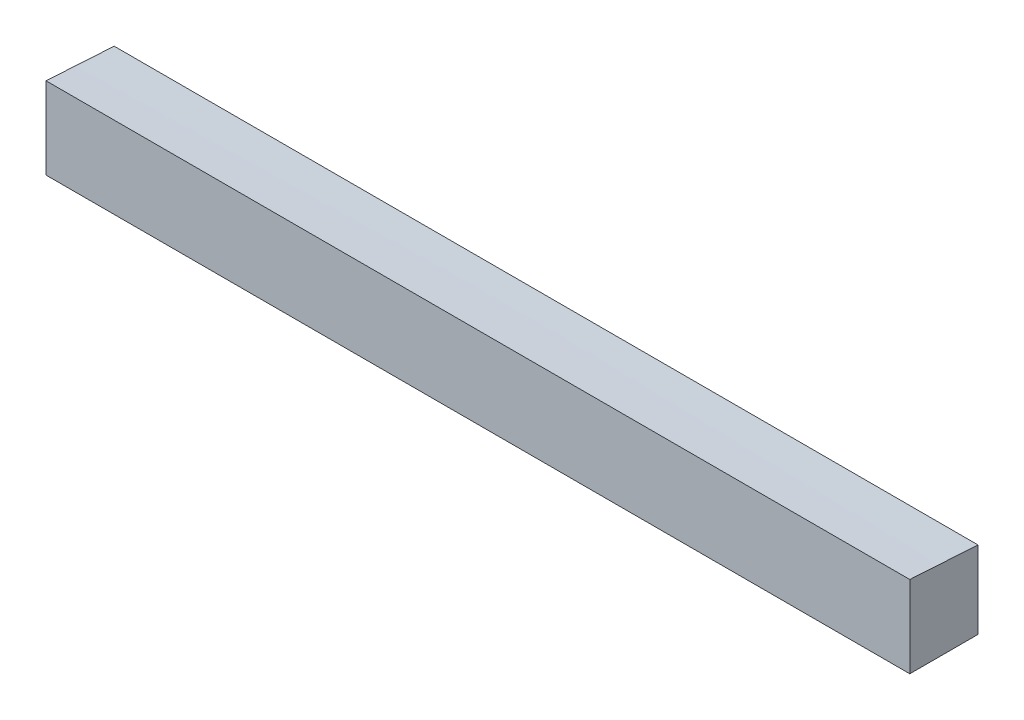
ISO-10303-21;
HEADER;
FILE_DESCRIPTION(('STEP AP214'),'2;1');
FILE_NAME('part.step','',(''),(''),'','','');
FILE_SCHEMA(('AUTOMOTIVE_DESIGN { 1 0 10303 214 1 1 1 1 }'));
ENDSEC;
DATA;
#1=APPLICATION_CONTEXT('core data for automotive mechanical design processes');
#2=APPLICATION_PROTOCOL_DEFINITION('international standard','automotive_design',2000,#1);
#3=PRODUCT_CONTEXT('',#1,'mechanical');
#4=PRODUCT('Part','Part','',(#3));
#5=PRODUCT_RELATED_PRODUCT_CATEGORY('part','',(#4));
#6=PRODUCT_DEFINITION_FORMATION('','',#4);
#7=PRODUCT_DEFINITION_CONTEXT('part definition',#1,'design');
#8=PRODUCT_DEFINITION('design','',#6,#7);
#9=PRODUCT_DEFINITION_SHAPE('','',#8);
#10=(LENGTH_UNIT() NAMED_UNIT(*) SI_UNIT(.MILLI.,.METRE.));
#11=(NAMED_UNIT(*) PLANE_ANGLE_UNIT() SI_UNIT($,.RADIAN.));
#12=(NAMED_UNIT(*) SI_UNIT($,.STERADIAN.) SOLID_ANGLE_UNIT());
#13=UNCERTAINTY_MEASURE_WITH_UNIT(LENGTH_MEASURE(1.E-05),#10,'distance_accuracy_value','');
#14=(GEOMETRIC_REPRESENTATION_CONTEXT(3) GLOBAL_UNCERTAINTY_ASSIGNED_CONTEXT((#13)) GLOBAL_UNIT_ASSIGNED_CONTEXT((#10,
#11,#12)) REPRESENTATION_CONTEXT('',''));
#15=CARTESIAN_POINT('',(0.,0.,0.));
#16=DIRECTION('',(0.,0.,1.));
#17=DIRECTION('',(1.,0.,0.));
#18=AXIS2_PLACEMENT_3D('',#15,#16,#17);
#19=CARTESIAN_POINT('',(-200.,-196.883488142695,0.));
#20=CARTESIAN_POINT('',(-200.,-189.069163208415,-93.0446551492894));
#21=CARTESIAN_POINT('',(-200.,-207.243937597042,-302.610093537368));
#22=CARTESIAN_POINT('',(-200.,-209.075197803941,-413.146581257138));
#23=CARTESIAN_POINT('',(-200.,-149.907972883575,-472.384774493397));
#24=CARTESIAN_POINT('',(-200.,-57.0358984147016,-361.760258551688));
#25=CARTESIAN_POINT('',(-200.,250.000000000014,-480.000000000005));
#26=B_SPLINE_CURVE_WITH_KNOTS('',3,(#19,#20,#21,#22,#23,#24,#25),.UNSPECIFIED.,.F.,.F.,(4,1,1,1,
4),(0.,0.361871867439847,0.526261734758969,0.755385014590914,1.),.UNSPECIFIED.);
#27=DIRECTION('',(1.,0.,0.));
#28=VECTOR('',#27,1.);
#29=SURFACE_OF_LINEAR_EXTRUSION('',#26,#28);
#30=OFFSET_SURFACE('',#29,10.,.F.);
#31=DIRECTION('',(1.,0.,0.));
#32=VECTOR('',#31,1.);
#33=CARTESIAN_POINT('',(1.67918436749914E-13,-214.063970017158,-285.));
#34=LINE('',#33,#32);
#35=CARTESIAN_POINT('',(-190.,-214.063970017158,-285.));
#36=VERTEX_POINT('',#35);
#37=CARTESIAN_POINT('',(190.,-214.063970017158,-285.));
#38=VERTEX_POINT('',#37);
#39=EDGE_CURVE('E42',#36,#38,#34,.T.);
#40=ORIENTED_EDGE('',*,*,#39,.T.);
#41=CARTESIAN_POINT('',(190.,-206.848406491872,-0.83690040879665));
#42=CARTESIAN_POINT('',(190.,-206.680899729474,-2.83196435834714));
#43=CARTESIAN_POINT('',(190.,-206.524739920902,-4.82794940591907));
#44=CARTESIAN_POINT('',(190.,-206.229758714729,-8.86783995350959));
#45=CARTESIAN_POINT('',(190.,-206.091424591732,-10.9117811192717));
#46=CARTESIAN_POINT('',(190.,-205.697632628618,-17.1755782071918));
#47=CARTESIAN_POINT('',(190.,-205.474098659275,-21.3974546028109));
#48=CARTESIAN_POINT('',(190.,-205.089308396329,-30.0026610464738));
#49=CARTESIAN_POINT('',(190.,-204.930703285704,-34.3861057928549));
#50=CARTESIAN_POINT('',(190.,-204.6723096484,-43.2949730817195));
#51=CARTESIAN_POINT('',(190.,-204.574563993186,-47.8204536207943));
#52=CARTESIAN_POINT('',(190.,-204.434143727457,-56.9941016438361));
#53=CARTESIAN_POINT('',(190.,-204.393022699432,-61.642291834893));
#54=CARTESIAN_POINT('',(190.,-204.361933921012,-71.0422741164044));
#55=CARTESIAN_POINT('',(190.,-204.373125088734,-75.7940694243542));
#56=CARTESIAN_POINT('',(190.,-204.442589942356,-85.3823239687476));
#57=CARTESIAN_POINT('',(190.,-204.501702491738,-90.2187767666326));
#58=CARTESIAN_POINT('',(190.,-204.662884106211,-99.9575193365573));
#59=CARTESIAN_POINT('',(190.,-204.765533117713,-104.859799210251));
#60=CARTESIAN_POINT('',(190.,-205.132650540976,-119.690886641539));
#61=CARTESIAN_POINT('',(190.,-205.455107634532,-129.618269005237));
#62=CARTESIAN_POINT('',(190.,-206.218795525464,-149.512537428811));
#63=CARTESIAN_POINT('',(190.,-206.660548671311,-159.479402612641));
#64=CARTESIAN_POINT('',(190.,-208.097850487291,-188.913348352305));
#65=CARTESIAN_POINT('',(190.,-209.219720056613,-208.374164334439));
#66=CARTESIAN_POINT('',(190.,-210.987613690559,-237.032066844139));
#67=CARTESIAN_POINT('',(190.,-211.572827259253,-246.233228047827));
#68=CARTESIAN_POINT('',(190.,-212.446836672774,-259.83862152767));
#69=CARTESIAN_POINT('',(190.,-212.731126535985,-264.243125985354));
#70=CARTESIAN_POINT('',(190.,-213.289060704734,-272.89722728791));
#71=CARTESIAN_POINT('',(190.,-213.562727683203,-277.146822766935));
#72=CARTESIAN_POINT('',(190.,-214.094769678484,-285.473164528526));
#73=CARTESIAN_POINT('',(190.,-214.353313492666,-289.549899950289));
#74=CARTESIAN_POINT('',(190.,-214.850441949062,-297.512733151689));
#75=CARTESIAN_POINT('',(190.,-215.089394053153,-301.398807839575));
#76=CARTESIAN_POINT('',(190.,-215.542421833008,-308.962767304756));
#77=CARTESIAN_POINT('',(190.,-215.757144261278,-312.640613127198));
#78=CARTESIAN_POINT('',(190.,-216.157678425789,-319.776181037423));
#79=CARTESIAN_POINT('',(190.,-216.344452112103,-323.233848357707));
#80=CARTESIAN_POINT('',(190.,-216.680486192345,-329.94153700421));
#81=CARTESIAN_POINT('',(190.,-216.831331669813,-333.191476727294));
#82=CARTESIAN_POINT('',(190.,-217.08595049588,-339.501988729252));
#83=CARTESIAN_POINT('',(190.,-217.191969029704,-342.562466677417));
#84=CARTESIAN_POINT('',(190.,-217.347340099764,-348.512402677128));
#85=CARTESIAN_POINT('',(190.,-217.399548898466,-351.401780564259));
#86=CARTESIAN_POINT('',(190.,-217.437258729537,-357.027840327293));
#87=CARTESIAN_POINT('',(190.,-217.426151453857,-359.764491705852));
#88=CARTESIAN_POINT('',(190.,-217.326743144481,-365.103122161024));
#89=CARTESIAN_POINT('',(190.,-217.242231928415,-367.705162309784));
#90=CARTESIAN_POINT('',(190.,-216.985030043556,-372.791926850525));
#91=CARTESIAN_POINT('',(190.,-216.816325976363,-375.276841157314));
#92=CARTESIAN_POINT('',(190.,-216.379390283406,-380.145421228546));
#93=CARTESIAN_POINT('',(190.,-216.115075381989,-382.529428942616));
#94=CARTESIAN_POINT('',(190.,-215.475380674847,-387.210742385725));
#95=CARTESIAN_POINT('',(190.,-215.10354081459,-389.508516706862));
#96=CARTESIAN_POINT('',(190.,-214.451082268095,-392.916253057906));
#97=CARTESIAN_POINT('',(190.,-214.22027787381,-394.035865543185));
#98=CARTESIAN_POINT('',(190.,-213.727353254093,-396.257772541768));
#99=CARTESIAN_POINT('',(190.,-213.465529843328,-397.360132513627));
#100=CARTESIAN_POINT('',(190.,-212.90934490599,-399.54865971033));
#101=CARTESIAN_POINT('',(190.,-212.615216296005,-400.634886057611));
#102=CARTESIAN_POINT('',(190.,-211.993369004565,-402.792168712012));
#103=CARTESIAN_POINT('',(190.,-211.665814678645,-403.863272321521));
#104=CARTESIAN_POINT('',(190.,-210.976442480095,-405.989846060897));
#105=CARTESIAN_POINT('',(190.,-210.614761658881,-407.045360559698));
#106=CARTESIAN_POINT('',(190.,-209.856642441995,-409.138797964619));
#107=CARTESIAN_POINT('',(190.,-209.460357720043,-410.176776437627));
#108=CARTESIAN_POINT('',(190.,-208.632475578434,-412.233096192294));
#109=CARTESIAN_POINT('',(190.,-208.201046867728,-413.251505290433));
#110=CARTESIAN_POINT('',(190.,-207.302225358477,-415.26658709377));
#111=CARTESIAN_POINT('',(190.,-206.835012169975,-416.263339781266));
#112=CARTESIAN_POINT('',(190.,-205.863874471296,-418.232937355987));
#113=CARTESIAN_POINT('',(190.,-205.360135251458,-419.205873445784));
#114=CARTESIAN_POINT('',(190.,-204.315100840248,-421.125568827787));
#115=CARTESIAN_POINT('',(190.,-203.773990221215,-422.072428416929));
#116=CARTESIAN_POINT('',(190.,-202.653275615582,-423.937573643505));
#117=CARTESIAN_POINT('',(190.,-202.073847862406,-424.855964975864));
#118=CARTESIAN_POINT('',(190.,-200.875484241904,-426.661608932179));
#119=CARTESIAN_POINT('',(190.,-200.256707496636,-427.54896696487));
#120=CARTESIAN_POINT('',(190.,-198.978571054947,-429.289776188998));
#121=CARTESIAN_POINT('',(190.,-198.319343745931,-430.143324369179));
#122=CARTESIAN_POINT('',(190.,-196.959242416487,-431.813468642932));
#123=CARTESIAN_POINT('',(190.,-196.258463971665,-432.630142467503));
#124=CARTESIAN_POINT('',(190.,-194.814158435088,-434.223270603683));
#125=CARTESIAN_POINT('',(190.,-194.070680652332,-434.999769414184));
#126=CARTESIAN_POINT('',(190.,-192.922978736205,-436.131368298507));
#127=CARTESIAN_POINT('',(190.,-192.534991545494,-436.503048026284));
#128=CARTESIAN_POINT('',(190.,-191.748028320033,-437.234936695569));
#129=CARTESIAN_POINT('',(190.,-191.349047934296,-437.595140969973));
#130=CARTESIAN_POINT('',(190.,-190.540035743604,-438.303546317665));
#131=CARTESIAN_POINT('',(190.,-190.129995802685,-438.651738099706));
#132=CARTESIAN_POINT('',(190.,-189.298809005686,-439.335581710445));
#133=CARTESIAN_POINT('',(190.,-188.877650180738,-439.671219000767));
#134=CARTESIAN_POINT('',(190.,-188.024201965795,-440.329390655713));
#135=CARTESIAN_POINT('',(190.,-187.591896816373,-440.651904594766));
#136=CARTESIAN_POINT('',(190.,-186.716163149998,-441.283248585974));
#137=CARTESIAN_POINT('',(190.,-186.272715203689,-441.592051701354));
#138=CARTESIAN_POINT('',(190.,-185.374739783985,-442.195376338106));
#139=CARTESIAN_POINT('',(190.,-184.920189421378,-442.489863807975));
#140=CARTESIAN_POINT('',(190.,-184.000093261762,-443.06394697904));
#141=CARTESIAN_POINT('',(190.,-183.534521413077,-443.343500946001));
#142=CARTESIAN_POINT('',(190.,-182.592510176358,-443.887099114829));
#143=CARTESIAN_POINT('',(190.,-182.116041957033,-444.151093376444));
#144=CARTESIAN_POINT('',(190.,-181.152412298376,-444.662951998329));
#145=CARTESIAN_POINT('',(190.,-180.66521971025,-444.9107577418));
#146=CARTESIAN_POINT('',(190.,-179.680363681935,-445.389623467796));
#147=CARTESIAN_POINT('',(190.,-179.182667308238,-445.620615743395));
#148=CARTESIAN_POINT('',(190.,-178.1770744751,-446.065249984083));
#149=CARTESIAN_POINT('',(190.,-177.669143889956,-446.278814795585));
#150=CARTESIAN_POINT('',(190.,-176.643400721545,-446.688008256435));
#151=CARTESIAN_POINT('',(190.,-176.125553460959,-446.883550002813));
#152=CARTESIAN_POINT('',(190.,-175.080339714544,-447.256137635738));
#153=CARTESIAN_POINT('',(190.,-174.552938676629,-447.433086614169));
#154=CARTESIAN_POINT('',(190.,-173.489020609486,-447.767962350359));
#155=CARTESIAN_POINT('',(190.,-172.952469856015,-447.925781977363));
#156=CARTESIAN_POINT('',(190.,-171.87069029795,-448.221912542186));
#157=CARTESIAN_POINT('',(190.,-171.325429316785,-448.360105938194));
#158=CARTESIAN_POINT('',(190.,-170.226694818797,-448.616543048131));
#159=CARTESIAN_POINT('',(190.,-169.673191403954,-448.734658641859));
#160=CARTESIAN_POINT('',(190.,-168.558456891737,-448.950548929727));
#161=CARTESIAN_POINT('',(190.,-167.997198913117,-449.048184774707));
#162=CARTESIAN_POINT('',(190.,-166.867450436744,-449.222776904159));
#163=CARTESIAN_POINT('',(190.,-166.298936817892,-449.299583476186));
#164=CARTESIAN_POINT('',(190.,-165.15517313261,-449.432232060989));
#165=CARTESIAN_POINT('',(190.,-164.579904452414,-449.487913385525));
#166=CARTESIAN_POINT('',(190.,-163.423118256496,-449.578079523875));
#167=CARTESIAN_POINT('',(190.,-162.841587383374,-449.612392593291));
#168=CARTESIAN_POINT('',(190.,-161.672747034351,-449.659641039567));
#169=CARTESIAN_POINT('',(190.,-161.085430204629,-449.672393582274));
#170=CARTESIAN_POINT('',(190.,-159.905462717753,-449.676386779282));
#171=CARTESIAN_POINT('',(190.,-159.312811449488,-449.667433540854));
#172=CARTESIAN_POINT('',(190.,-158.12258744824,-449.627922920725));
#173=CARTESIAN_POINT('',(190.,-157.525021568557,-449.597160701174));
#174=CARTESIAN_POINT('',(190.,-156.325342709072,-449.513975793326));
#175=CARTESIAN_POINT('',(190.,-155.723244738951,-449.461337534733));
#176=CARTESIAN_POINT('',(190.,-154.514833979895,-449.334373520626));
#177=CARTESIAN_POINT('',(190.,-153.908545004899,-449.259821786912));
#178=CARTESIAN_POINT('',(190.,-152.692039800474,-449.089026124344));
#179=CARTESIAN_POINT('',(190.,-152.081856776564,-448.992546252874));
#180=CARTESIAN_POINT('',(190.,-150.8578054187,-448.777905145958));
#181=CARTESIAN_POINT('',(190.,-150.243980195928,-448.659498569156));
#182=CARTESIAN_POINT('',(190.,-149.012840208221,-448.401023340597));
#183=CARTESIAN_POINT('',(190.,-148.395578874953,-448.260700624457));
#184=CARTESIAN_POINT('',(190.,-147.157720613185,-447.958416440662));
#185=CARTESIAN_POINT('',(190.,-146.537187788355,-447.79619298806));
#186=CARTESIAN_POINT('',(190.,-145.292889740189,-447.450122815611));
#187=CARTESIAN_POINT('',(190.,-144.66919938239,-447.266006994332));
#188=CARTESIAN_POINT('',(190.,-143.418684676956,-446.876179550672));
#189=CARTESIAN_POINT('',(190.,-142.791946540861,-446.670192931452));
#190=CARTESIAN_POINT('',(190.,-140.892346262428,-446.014719904194));
#191=CARTESIAN_POINT('',(190.,-139.629453409923,-445.535931557919));
#192=CARTESIAN_POINT('',(190.,-137.741313424412,-444.760299070792));
#193=CARTESIAN_POINT('',(190.,-137.10551687113,-444.488625011567));
#194=CARTESIAN_POINT('',(190.,-135.833351376189,-443.924472958441));
#195=CARTESIAN_POINT('',(190.,-135.197081257116,-443.631771452008));
#196=CARTESIAN_POINT('',(190.,-133.298901367262,-442.73124799881));
#197=CARTESIAN_POINT('',(190.,-132.047668052923,-442.101026333054));
#198=CARTESIAN_POINT('',(190.,-129.552683711011,-440.801507030489));
#199=CARTESIAN_POINT('',(190.,-128.309083330141,-440.131926115796));
#200=CARTESIAN_POINT('',(190.,-125.804092380674,-438.766551743186));
#201=CARTESIAN_POINT('',(190.,-124.542842713502,-438.070501853988));
#202=CARTESIAN_POINT('',(190.,-121.979068012844,-436.662411301967));
#203=CARTESIAN_POINT('',(190.,-120.676455350504,-435.950528930046));
#204=CARTESIAN_POINT('',(190.,-118.007940751132,-434.519482982449));
#205=CARTESIAN_POINT('',(190.,-116.641584694367,-433.801158978827));
#206=CARTESIAN_POINT('',(190.,-113.824553568488,-432.365398036719));
#207=CARTESIAN_POINT('',(190.,-112.37299542901,-431.649682630415));
#208=CARTESIAN_POINT('',(190.,-109.365055109549,-430.227305486088));
#209=CARTESIAN_POINT('',(190.,-107.80736113623,-429.523404899872));
#210=CARTESIAN_POINT('',(190.,-104.566867203115,-428.13321298125));
#211=CARTESIAN_POINT('',(190.,-102.882380116109,-427.450842785472));
#212=CARTESIAN_POINT('',(190.,-99.3681048852071,-426.112929051726));
#213=CARTESIAN_POINT('',(190.,-97.5363514885187,-425.462541431636));
#214=CARTESIAN_POINT('',(190.,-93.7074380834072,-424.198655158072));
#215=CARTESIAN_POINT('',(190.,-91.7081635955178,-423.591566099555));
#216=CARTESIAN_POINT('',(190.,-87.5242836403395,-422.425272867135));
#217=CARTESIAN_POINT('',(190.,-85.3375591934523,-421.873689488976));
#218=CARTESIAN_POINT('',(190.,-80.759162994672,-420.830333917941));
#219=CARTESIAN_POINT('',(190.,-78.3655109169213,-420.347293232865));
#220=CARTESIAN_POINT('',(190.,-73.3540675458148,-419.45379857025));
#221=CARTESIAN_POINT('',(190.,-70.7345607102679,-419.053040029475));
#222=CARTESIAN_POINT('',(190.,-65.2527174076371,-418.337600696241));
#223=CARTESIAN_POINT('',(190.,-62.3890286614597,-418.033403029719));
#224=CARTESIAN_POINT('',(190.,-56.4006601271486,-417.525134746128));
#225=CARTESIAN_POINT('',(190.,-53.2750574571997,-417.332147050876));
#226=CARTESIAN_POINT('',(190.,-46.7452110076733,-417.060750636511));
#227=CARTESIAN_POINT('',(190.,-43.3405081344027,-416.993840498795));
#228=CARTESIAN_POINT('',(190.,-36.2352722261545,-416.989316741283));
#229=CARTESIAN_POINT('',(190.,-32.5347507811428,-417.063448192556));
#230=CARTESIAN_POINT('',(190.,-24.8210812188987,-417.355880608669));
#231=CARTESIAN_POINT('',(190.,-20.8084008284192,-417.586025608156));
#232=CARTESIAN_POINT('',(190.,-12.4539353232367,-418.205431541476));
#233=CARTESIAN_POINT('',(190.,-8.11304444931164,-418.606512370698));
#234=CARTESIAN_POINT('',(190.,0.914072479054373,-419.582752922996));
#235=CARTESIAN_POINT('',(190.,5.59901674519772,-420.16960964894));
#236=CARTESIAN_POINT('',(190.,15.3302858776807,-421.532344863796));
#237=CARTESIAN_POINT('',(190.,20.374985070204,-422.319721188753));
#238=CARTESIAN_POINT('',(190.,30.8416765826227,-424.098396854754));
#239=CARTESIAN_POINT('',(190.,36.2617442324815,-425.10093826696));
#240=CARTESIAN_POINT('',(190.,47.4949938936285,-427.324792779908));
#241=CARTESIAN_POINT('',(190.,53.3059959597691,-428.557052145574));
#242=CARTESIAN_POINT('',(190.,65.3368764501112,-431.255134650196));
#243=CARTESIAN_POINT('',(190.,71.5543606912028,-432.731581713853));
#244=CARTESIAN_POINT('',(190.,84.4139321931525,-435.932775414948));
#245=CARTESIAN_POINT('',(190.,91.0534485309206,-437.667807844087));
#246=CARTESIAN_POINT('',(190.,104.772793202531,-441.400854544702));
#247=CARTESIAN_POINT('',(190.,111.849907478954,-443.408809031086));
#248=CARTESIAN_POINT('',(190.,126.460150741597,-447.702332640811));
#249=CARTESIAN_POINT('',(190.,133.990452114216,-449.997495314386));
#250=CARTESIAN_POINT('',(190.,149.522778311725,-454.880022904477));
#251=CARTESIAN_POINT('',(190.,157.521888002841,-457.47663832987));
#252=CARTESIAN_POINT('',(190.,174.00753552938,-462.976619182039));
#253=CARTESIAN_POINT('',(190.,182.491092129731,-465.888899182761));
#254=CARTESIAN_POINT('',(190.,199.961402316681,-472.034717940555));
#255=CARTESIAN_POINT('',(190.,208.945131087831,-475.27684461888));
#256=CARTESIAN_POINT('',(190.,222.596366897664,-480.313104389418));
#257=CARTESIAN_POINT('',(190.,227.280956388311,-482.061143348394));
#258=CARTESIAN_POINT('',(190.,236.781446361964,-485.644035332574));
#259=CARTESIAN_POINT('',(190.,241.596963136514,-487.479906069613));
#260=CARTESIAN_POINT('',(190.,246.40626416593,-489.331937781346));
#261=B_SPLINE_CURVE_WITH_KNOTS('',3,(#41,#42,#43,#44,#45,#46,#47,#48,#49,#50,#51,#52,#53,#54,
#55,#56,#57,#58,#59,#60,#61,#62,#63,#64,#65,#66,#67,#68,#69,#70,#71,#72,#73,#74,#75,#76,#77,#78,
#79,#80,#81,#82,#83,#84,#85,#86,#87,#88,#89,#90,#91,#92,#93,#94,#95,#96,#97,#98,#99,#100,#101,
#102,#103,#104,#105,#106,#107,#108,#109,#110,#111,#112,#113,#114,#115,#116,#117,#118,#119,#120,
#121,#122,#123,#124,#125,#126,#127,#128,#129,#130,#131,#132,#133,#134,#135,#136,#137,#138,#139,
#140,#141,#142,#143,#144,#145,#146,#147,#148,#149,#150,#151,#152,#153,#154,#155,#156,#157,#158,
#159,#160,#161,#162,#163,#164,#165,#166,#167,#168,#169,#170,#171,#172,#173,#174,#175,#176,#177,
#178,#179,#180,#181,#182,#183,#184,#185,#186,#187,#188,#189,#190,#191,#192,#193,#194,#195,#196,
#197,#198,#199,#200,#201,#202,#203,#204,#205,#206,#207,#208,#209,#210,#211,#212,#213,#214,#215,
#216,#217,#218,#219,#220,#221,#222,#223,#224,#225,#226,#227,#228,#229,#230,#231,#232,#233,#234,
#235,#236,#237,#238,#239,#240,#241,#242,#243,#244,#245,#246,#247,#248,#249,#250,#251,#252,#253,
#254,#255,#256,#257,#258,#259,#260),.UNSPECIFIED.,.F.,.F.,(4,2,2,2,2,2,2,2,2,2,2,2,2,2,2,2,2,2,
2,2,2,2,2,2,2,2,2,2,2,2,2,2,2,2,2,2,2,2,2,2,2,2,2,2,2,2,2,2,2,2,2,2,2,2,2,2,2,2,2,2,2,2,2,2,2,2,
2,2,2,2,2,2,2,2,2,2,2,2,2,2,2,2,2,2,2,2,2,2,2,2,2,2,2,2,2,2,2,2,2,2,2,2,2,2,2,2,2,2,2,4),(0.,
6.00616812600453,12.1519167653748,24.8345222374942,37.9929541272527,51.5721370337467,
65.5169244394189,79.7720886970808,94.282320285502,108.992232666119,138.789048351388,
168.718508955115,227.195851528579,254.855190715289,268.096192984184,280.871388903668,
293.126161567196,304.806391939028,315.858695695924,326.246766550717,336.006938425829,
345.193583714362,353.862607447494,362.071771175223,369.880714596479,377.350714603268,
384.544107957686,391.523394076183,394.952429498747,398.35096376079,401.726430294479,
405.086033537666,408.432676593063,411.765147626857,415.082470295225,418.384114652931,
421.670046511134,424.940773098537,428.197381993567,431.441569484882,434.675653713514,
437.902567637347,441.125827272641,442.73750237018,444.34982478331,445.963367519931,
447.578724311101,449.196505969038,450.817336785296,452.441851130001,454.070690478257,
455.704501090139,457.343932550967,458.989637373116,460.642271861979,462.302498303801,
463.97098854936,465.648428919524,467.335526287346,469.033015109669,470.741665040038,
472.462288800648,474.195749832423,475.942969343951,477.704932378877,479.482692523672,
481.277375107128,483.090178663222,484.922374680145,486.77530567946,488.650381750403,
490.549075795852,492.47291767327,494.423487599741,496.402408979031,500.451552220075,
502.525589652717,504.626434975609,508.828274963022,513.065337891659,517.38704453429,
521.84031943342,526.470989139896,531.325512254823,536.452414008207,541.903176406507,
547.732562765125,553.998480330165,560.761539408908,568.084471238669,576.031536089217,
584.668006150884,594.059761368659,604.273001343258,615.374056279244,627.429272549894,
640.504949205914,654.667306445451,669.982472554585,686.516480613653,704.335269836516,
723.504688749373,744.090498863615,766.158378276374,789.773925040991,815.002660321971,
841.910031397885,870.561414585462,885.561619349176,901.022309016377),.UNSPECIFIED.);
#262=CARTESIAN_POINT('',(190.,-215.889264261175,-315.));
#263=VERTEX_POINT('',#262);
#264=EDGE_CURVE('E83',#38,#263,#261,.T.);
#265=ORIENTED_EDGE('',*,*,#264,.T.);
#266=DIRECTION('',(1.,0.,0.));
#267=VECTOR('',#266,1.);
#268=CARTESIAN_POINT('',(1.4016343591938E-13,-215.889264261175,-315.));
#269=LINE('',#268,#267);
#270=CARTESIAN_POINT('',(-190.,-215.889264261175,-315.));
#271=VERTEX_POINT('',#270);
#272=EDGE_CURVE('E11',#263,#271,#269,.F.);
#273=ORIENTED_EDGE('',*,*,#272,.T.);
#274=CARTESIAN_POINT('',(-190.,-206.848406491872,-0.83690040879665));
#275=CARTESIAN_POINT('',(-190.,-206.680899729474,-2.83196435834714));
#276=CARTESIAN_POINT('',(-190.,-206.524739920902,-4.82794940591907));
#277=CARTESIAN_POINT('',(-190.,-206.229758714729,-8.86783995350959));
#278=CARTESIAN_POINT('',(-190.,-206.091424591732,-10.9117811192717));
#279=CARTESIAN_POINT('',(-190.,-205.697632628618,-17.1755782071918));
#280=CARTESIAN_POINT('',(-190.,-205.474098659275,-21.3974546028109));
#281=CARTESIAN_POINT('',(-190.,-205.089308396329,-30.0026610464738));
#282=CARTESIAN_POINT('',(-190.,-204.930703285704,-34.3861057928549));
#283=CARTESIAN_POINT('',(-190.,-204.6723096484,-43.2949730817195));
#284=CARTESIAN_POINT('',(-190.,-204.574563993186,-47.8204536207943));
#285=CARTESIAN_POINT('',(-190.,-204.434143727457,-56.9941016438361));
#286=CARTESIAN_POINT('',(-190.,-204.393022699433,-61.642291834893));
#287=CARTESIAN_POINT('',(-190.,-204.361933921012,-71.0422741164044));
#288=CARTESIAN_POINT('',(-190.,-204.373125088734,-75.7940694243542));
#289=CARTESIAN_POINT('',(-190.,-204.442589942356,-85.3823239687476));
#290=CARTESIAN_POINT('',(-190.,-204.501702491738,-90.2187767666326));
#291=CARTESIAN_POINT('',(-190.,-204.662884106211,-99.9575193365573));
#292=CARTESIAN_POINT('',(-190.,-204.765533117713,-104.859799210251));
#293=CARTESIAN_POINT('',(-190.,-205.132650540976,-119.690886641539));
#294=CARTESIAN_POINT('',(-190.,-205.455107634532,-129.618269005237));
#295=CARTESIAN_POINT('',(-190.,-206.218795525464,-149.512537428811));
#296=CARTESIAN_POINT('',(-190.,-206.660548671311,-159.479402612641));
#297=CARTESIAN_POINT('',(-190.,-208.097850487291,-188.913348352305));
#298=CARTESIAN_POINT('',(-190.,-209.219720056613,-208.374164334439));
#299=CARTESIAN_POINT('',(-190.,-210.987613690559,-237.032066844139));
#300=CARTESIAN_POINT('',(-190.,-211.572827259253,-246.233228047827));
#301=CARTESIAN_POINT('',(-190.,-212.446836672774,-259.83862152767));
#302=CARTESIAN_POINT('',(-190.,-212.731126535985,-264.243125985354));
#303=CARTESIAN_POINT('',(-190.,-213.289060704734,-272.89722728791));
#304=CARTESIAN_POINT('',(-190.,-213.562727683203,-277.146822766935));
#305=CARTESIAN_POINT('',(-190.,-214.094769678484,-285.473164528526));
#306=CARTESIAN_POINT('',(-190.,-214.353313492666,-289.549899950289));
#307=CARTESIAN_POINT('',(-190.,-214.850441949062,-297.512733151689));
#308=CARTESIAN_POINT('',(-190.,-215.089394053153,-301.398807839575));
#309=CARTESIAN_POINT('',(-190.,-215.542421833008,-308.962767304756));
#310=CARTESIAN_POINT('',(-190.,-215.757144261278,-312.640613127198));
#311=CARTESIAN_POINT('',(-190.,-216.15767842579,-319.776181037423));
#312=CARTESIAN_POINT('',(-190.,-216.344452112103,-323.233848357707));
#313=CARTESIAN_POINT('',(-190.,-216.680486192346,-329.94153700421));
#314=CARTESIAN_POINT('',(-190.,-216.831331669813,-333.191476727294));
#315=CARTESIAN_POINT('',(-190.,-217.08595049588,-339.501988729252));
#316=CARTESIAN_POINT('',(-190.,-217.191969029704,-342.562466677417));
#317=CARTESIAN_POINT('',(-190.,-217.347340099764,-348.512402677128));
#318=CARTESIAN_POINT('',(-190.,-217.399548898466,-351.401780564259));
#319=CARTESIAN_POINT('',(-190.,-217.437258729537,-357.027840327293));
#320=CARTESIAN_POINT('',(-190.,-217.426151453857,-359.764491705852));
#321=CARTESIAN_POINT('',(-190.,-217.326743144481,-365.103122161024));
#322=CARTESIAN_POINT('',(-190.,-217.242231928415,-367.705162309784));
#323=CARTESIAN_POINT('',(-190.,-216.985030043556,-372.791926850525));
#324=CARTESIAN_POINT('',(-190.,-216.816325976363,-375.276841157314));
#325=CARTESIAN_POINT('',(-190.,-216.379390283407,-380.145421228546));
#326=CARTESIAN_POINT('',(-190.,-216.115075381989,-382.529428942616));
#327=CARTESIAN_POINT('',(-190.,-215.475380674847,-387.210742385725));
#328=CARTESIAN_POINT('',(-190.,-215.10354081459,-389.508516706862));
#329=CARTESIAN_POINT('',(-190.,-214.451082268095,-392.916253057906));
#330=CARTESIAN_POINT('',(-190.,-214.22027787381,-394.035865543185));
#331=CARTESIAN_POINT('',(-190.,-213.727353254093,-396.257772541768));
#332=CARTESIAN_POINT('',(-190.,-213.465529843328,-397.360132513627));
#333=CARTESIAN_POINT('',(-190.,-212.90934490599,-399.54865971033));
#334=CARTESIAN_POINT('',(-190.,-212.615216296005,-400.634886057611));
#335=CARTESIAN_POINT('',(-190.,-211.993369004565,-402.792168712012));
#336=CARTESIAN_POINT('',(-190.,-211.665814678645,-403.863272321521));
#337=CARTESIAN_POINT('',(-190.,-210.976442480095,-405.989846060897));
#338=CARTESIAN_POINT('',(-190.,-210.614761658881,-407.045360559698));
#339=CARTESIAN_POINT('',(-190.,-209.856642441995,-409.138797964619));
#340=CARTESIAN_POINT('',(-190.,-209.460357720043,-410.176776437627));
#341=CARTESIAN_POINT('',(-190.,-208.632475578434,-412.233096192294));
#342=CARTESIAN_POINT('',(-190.,-208.201046867728,-413.251505290433));
#343=CARTESIAN_POINT('',(-190.,-207.302225358477,-415.26658709377));
#344=CARTESIAN_POINT('',(-190.,-206.835012169975,-416.263339781266));
#345=CARTESIAN_POINT('',(-190.,-205.863874471296,-418.232937355987));
#346=CARTESIAN_POINT('',(-190.,-205.360135251458,-419.205873445784));
#347=CARTESIAN_POINT('',(-190.,-204.315100840248,-421.125568827787));
#348=CARTESIAN_POINT('',(-190.,-203.773990221215,-422.072428416929));
#349=CARTESIAN_POINT('',(-190.,-202.653275615583,-423.937573643505));
#350=CARTESIAN_POINT('',(-190.,-202.073847862406,-424.855964975864));
#351=CARTESIAN_POINT('',(-190.,-200.875484241904,-426.661608932179));
#352=CARTESIAN_POINT('',(-190.,-200.256707496636,-427.54896696487));
#353=CARTESIAN_POINT('',(-190.,-198.978571054947,-429.289776188998));
#354=CARTESIAN_POINT('',(-190.,-198.319343745931,-430.143324369179));
#355=CARTESIAN_POINT('',(-190.,-196.959242416487,-431.813468642932));
#356=CARTESIAN_POINT('',(-190.,-196.258463971665,-432.630142467503));
#357=CARTESIAN_POINT('',(-190.,-194.814158435088,-434.223270603683));
#358=CARTESIAN_POINT('',(-190.,-194.070680652332,-434.999769414184));
#359=CARTESIAN_POINT('',(-190.,-192.922978736205,-436.131368298507));
#360=CARTESIAN_POINT('',(-190.,-192.534991545494,-436.503048026284));
#361=CARTESIAN_POINT('',(-190.,-191.748028320033,-437.234936695569));
#362=CARTESIAN_POINT('',(-190.,-191.349047934296,-437.595140969973));
#363=CARTESIAN_POINT('',(-190.,-190.540035743604,-438.303546317665));
#364=CARTESIAN_POINT('',(-190.,-190.129995802685,-438.651738099706));
#365=CARTESIAN_POINT('',(-190.,-189.298809005686,-439.335581710445));
#366=CARTESIAN_POINT('',(-190.,-188.877650180739,-439.671219000767));
#367=CARTESIAN_POINT('',(-190.,-188.024201965795,-440.329390655713));
#368=CARTESIAN_POINT('',(-190.,-187.591896816373,-440.651904594766));
#369=CARTESIAN_POINT('',(-190.,-186.716163149998,-441.283248585974));
#370=CARTESIAN_POINT('',(-190.,-186.272715203689,-441.592051701354));
#371=CARTESIAN_POINT('',(-190.,-185.374739783985,-442.195376338106));
#372=CARTESIAN_POINT('',(-190.,-184.920189421378,-442.489863807975));
#373=CARTESIAN_POINT('',(-190.,-184.000093261762,-443.06394697904));
#374=CARTESIAN_POINT('',(-190.,-183.534521413077,-443.343500946001));
#375=CARTESIAN_POINT('',(-190.,-182.592510176358,-443.887099114829));
#376=CARTESIAN_POINT('',(-190.,-182.116041957033,-444.151093376444));
#377=CARTESIAN_POINT('',(-190.,-181.152412298376,-444.662951998329));
#378=CARTESIAN_POINT('',(-190.,-180.66521971025,-444.9107577418));
#379=CARTESIAN_POINT('',(-190.,-179.680363681935,-445.389623467796));
#380=CARTESIAN_POINT('',(-190.,-179.182667308238,-445.620615743395));
#381=CARTESIAN_POINT('',(-190.,-178.1770744751,-446.065249984083));
#382=CARTESIAN_POINT('',(-190.,-177.669143889956,-446.278814795585));
#383=CARTESIAN_POINT('',(-190.,-176.643400721545,-446.688008256435));
#384=CARTESIAN_POINT('',(-190.,-176.125553460959,-446.883550002813));
#385=CARTESIAN_POINT('',(-190.,-175.080339714544,-447.256137635738));
#386=CARTESIAN_POINT('',(-190.,-174.552938676629,-447.433086614169));
#387=CARTESIAN_POINT('',(-190.,-173.489020609486,-447.767962350359));
#388=CARTESIAN_POINT('',(-190.,-172.952469856015,-447.925781977363));
#389=CARTESIAN_POINT('',(-190.,-171.870690297951,-448.221912542186));
#390=CARTESIAN_POINT('',(-190.,-171.325429316785,-448.360105938194));
#391=CARTESIAN_POINT('',(-190.,-170.226694818797,-448.616543048131));
#392=CARTESIAN_POINT('',(-190.,-169.673191403955,-448.734658641859));
#393=CARTESIAN_POINT('',(-190.,-168.558456891737,-448.950548929727));
#394=CARTESIAN_POINT('',(-190.,-167.997198913117,-449.048184774707));
#395=CARTESIAN_POINT('',(-190.,-166.867450436745,-449.222776904159));
#396=CARTESIAN_POINT('',(-190.,-166.298936817892,-449.299583476186));
#397=CARTESIAN_POINT('',(-190.,-165.15517313261,-449.432232060989));
#398=CARTESIAN_POINT('',(-190.,-164.579904452414,-449.487913385525));
#399=CARTESIAN_POINT('',(-190.,-163.423118256496,-449.578079523875));
#400=CARTESIAN_POINT('',(-190.,-162.841587383374,-449.612392593291));
#401=CARTESIAN_POINT('',(-190.,-161.672747034352,-449.659641039567));
#402=CARTESIAN_POINT('',(-190.,-161.085430204629,-449.672393582274));
#403=CARTESIAN_POINT('',(-190.,-159.905462717753,-449.676386779282));
#404=CARTESIAN_POINT('',(-190.,-159.312811449488,-449.667433540854));
#405=CARTESIAN_POINT('',(-190.,-158.12258744824,-449.627922920725));
#406=CARTESIAN_POINT('',(-190.,-157.525021568557,-449.597160701174));
#407=CARTESIAN_POINT('',(-190.,-156.325342709072,-449.513975793326));
#408=CARTESIAN_POINT('',(-190.,-155.723244738952,-449.461337534733));
#409=CARTESIAN_POINT('',(-190.,-154.514833979895,-449.334373520626));
#410=CARTESIAN_POINT('',(-190.,-153.908545004899,-449.259821786912));
#411=CARTESIAN_POINT('',(-190.,-152.692039800474,-449.089026124344));
#412=CARTESIAN_POINT('',(-190.,-152.081856776564,-448.992546252874));
#413=CARTESIAN_POINT('',(-190.,-150.8578054187,-448.777905145958));
#414=CARTESIAN_POINT('',(-190.,-150.243980195928,-448.659498569156));
#415=CARTESIAN_POINT('',(-190.,-149.012840208221,-448.401023340597));
#416=CARTESIAN_POINT('',(-190.,-148.395578874953,-448.260700624457));
#417=CARTESIAN_POINT('',(-190.,-147.157720613185,-447.958416440662));
#418=CARTESIAN_POINT('',(-190.,-146.537187788355,-447.79619298806));
#419=CARTESIAN_POINT('',(-190.,-145.292889740189,-447.450122815611));
#420=CARTESIAN_POINT('',(-190.,-144.66919938239,-447.266006994332));
#421=CARTESIAN_POINT('',(-190.,-143.418684676956,-446.876179550672));
#422=CARTESIAN_POINT('',(-190.,-142.791946540861,-446.670192931452));
#423=CARTESIAN_POINT('',(-190.,-140.892346262428,-446.014719904194));
#424=CARTESIAN_POINT('',(-190.,-139.629453409923,-445.535931557919));
#425=CARTESIAN_POINT('',(-190.,-137.741313424412,-444.760299070792));
#426=CARTESIAN_POINT('',(-190.,-137.10551687113,-444.488625011567));
#427=CARTESIAN_POINT('',(-190.,-135.833351376189,-443.924472958441));
#428=CARTESIAN_POINT('',(-190.,-135.197081257116,-443.631771452008));
#429=CARTESIAN_POINT('',(-190.,-133.298901367262,-442.73124799881));
#430=CARTESIAN_POINT('',(-190.,-132.047668052924,-442.101026333054));
#431=CARTESIAN_POINT('',(-190.,-129.552683711011,-440.801507030489));
#432=CARTESIAN_POINT('',(-190.,-128.309083330141,-440.131926115796));
#433=CARTESIAN_POINT('',(-190.,-125.804092380674,-438.766551743186));
#434=CARTESIAN_POINT('',(-190.,-124.542842713502,-438.070501853988));
#435=CARTESIAN_POINT('',(-190.,-121.979068012845,-436.662411301967));
#436=CARTESIAN_POINT('',(-190.,-120.676455350504,-435.950528930046));
#437=CARTESIAN_POINT('',(-190.,-118.007940751132,-434.519482982449));
#438=CARTESIAN_POINT('',(-190.,-116.641584694367,-433.801158978827));
#439=CARTESIAN_POINT('',(-190.,-113.824553568488,-432.365398036719));
#440=CARTESIAN_POINT('',(-190.,-112.37299542901,-431.649682630415));
#441=CARTESIAN_POINT('',(-190.,-109.365055109549,-430.227305486088));
#442=CARTESIAN_POINT('',(-190.,-107.80736113623,-429.523404899872));
#443=CARTESIAN_POINT('',(-190.,-104.566867203116,-428.13321298125));
#444=CARTESIAN_POINT('',(-190.,-102.882380116109,-427.450842785472));
#445=CARTESIAN_POINT('',(-190.,-99.3681048852072,-426.112929051726));
#446=CARTESIAN_POINT('',(-190.,-97.5363514885188,-425.462541431636));
#447=CARTESIAN_POINT('',(-190.,-93.7074380834072,-424.198655158072));
#448=CARTESIAN_POINT('',(-190.,-91.7081635955179,-423.591566099555));
#449=CARTESIAN_POINT('',(-190.,-87.5242836403396,-422.425272867135));
#450=CARTESIAN_POINT('',(-190.,-85.3375591934523,-421.873689488976));
#451=CARTESIAN_POINT('',(-190.,-80.759162994672,-420.830333917941));
#452=CARTESIAN_POINT('',(-190.,-78.3655109169214,-420.347293232865));
#453=CARTESIAN_POINT('',(-190.,-73.3540675458149,-419.45379857025));
#454=CARTESIAN_POINT('',(-190.,-70.7345607102679,-419.053040029475));
#455=CARTESIAN_POINT('',(-190.,-65.2527174076372,-418.337600696241));
#456=CARTESIAN_POINT('',(-190.,-62.3890286614597,-418.033403029719));
#457=CARTESIAN_POINT('',(-190.,-56.4006601271487,-417.525134746128));
#458=CARTESIAN_POINT('',(-190.,-53.2750574571998,-417.332147050876));
#459=CARTESIAN_POINT('',(-190.,-46.7452110076733,-417.060750636511));
#460=CARTESIAN_POINT('',(-190.,-43.3405081344027,-416.993840498795));
#461=CARTESIAN_POINT('',(-190.,-36.2352722261545,-416.989316741283));
#462=CARTESIAN_POINT('',(-190.,-32.5347507811429,-417.063448192556));
#463=CARTESIAN_POINT('',(-190.,-24.8210812188987,-417.355880608669));
#464=CARTESIAN_POINT('',(-190.,-20.8084008284193,-417.586025608156));
#465=CARTESIAN_POINT('',(-190.,-12.4539353232368,-418.205431541476));
#466=CARTESIAN_POINT('',(-190.,-8.11304444931169,-418.606512370698));
#467=CARTESIAN_POINT('',(-190.,0.914072479054318,-419.582752922996));
#468=CARTESIAN_POINT('',(-190.,5.59901674519767,-420.16960964894));
#469=CARTESIAN_POINT('',(-190.,15.3302858776806,-421.532344863796));
#470=CARTESIAN_POINT('',(-190.,20.374985070204,-422.319721188753));
#471=CARTESIAN_POINT('',(-190.,30.8416765826227,-424.098396854754));
#472=CARTESIAN_POINT('',(-190.,36.2617442324815,-425.10093826696));
#473=CARTESIAN_POINT('',(-190.,47.4949938936284,-427.324792779908));
#474=CARTESIAN_POINT('',(-190.,53.305995959769,-428.557052145574));
#475=CARTESIAN_POINT('',(-190.,65.3368764501111,-431.255134650196));
#476=CARTESIAN_POINT('',(-190.,71.5543606912027,-432.731581713853));
#477=CARTESIAN_POINT('',(-190.,84.4139321931524,-435.932775414948));
#478=CARTESIAN_POINT('',(-190.,91.0534485309205,-437.667807844087));
#479=CARTESIAN_POINT('',(-190.,104.772793202531,-441.400854544702));
#480=CARTESIAN_POINT('',(-190.,111.849907478954,-443.408809031086));
#481=CARTESIAN_POINT('',(-190.,126.460150741597,-447.702332640811));
#482=CARTESIAN_POINT('',(-190.,133.990452114216,-449.997495314386));
#483=CARTESIAN_POINT('',(-190.,149.522778311725,-454.880022904477));
#484=CARTESIAN_POINT('',(-190.,157.52188800284,-457.47663832987));
#485=CARTESIAN_POINT('',(-190.,174.00753552938,-462.976619182039));
#486=CARTESIAN_POINT('',(-190.,182.491092129731,-465.888899182761));
#487=CARTESIAN_POINT('',(-190.,199.961402316681,-472.034717940555));
#488=CARTESIAN_POINT('',(-190.,208.945131087831,-475.27684461888));
#489=CARTESIAN_POINT('',(-190.,222.596366897664,-480.313104389418));
#490=CARTESIAN_POINT('',(-190.,227.280956388311,-482.061143348394));
#491=CARTESIAN_POINT('',(-190.,236.781446361964,-485.644035332574));
#492=CARTESIAN_POINT('',(-190.,241.596963136514,-487.479906069613));
#493=CARTESIAN_POINT('',(-190.,246.40626416593,-489.331937781346));
#494=B_SPLINE_CURVE_WITH_KNOTS('',3,(#274,#275,#276,#277,#278,#279,#280,#281,#282,#283,#284,
#285,#286,#287,#288,#289,#290,#291,#292,#293,#294,#295,#296,#297,#298,#299,#300,#301,#302,#303,
#304,#305,#306,#307,#308,#309,#310,#311,#312,#313,#314,#315,#316,#317,#318,#319,#320,#321,#322,
#323,#324,#325,#326,#327,#328,#329,#330,#331,#332,#333,#334,#335,#336,#337,#338,#339,#340,#341,
#342,#343,#344,#345,#346,#347,#348,#349,#350,#351,#352,#353,#354,#355,#356,#357,#358,#359,#360,
#361,#362,#363,#364,#365,#366,#367,#368,#369,#370,#371,#372,#373,#374,#375,#376,#377,#378,#379,
#380,#381,#382,#383,#384,#385,#386,#387,#388,#389,#390,#391,#392,#393,#394,#395,#396,#397,#398,
#399,#400,#401,#402,#403,#404,#405,#406,#407,#408,#409,#410,#411,#412,#413,#414,#415,#416,#417,
#418,#419,#420,#421,#422,#423,#424,#425,#426,#427,#428,#429,#430,#431,#432,#433,#434,#435,#436,
#437,#438,#439,#440,#441,#442,#443,#444,#445,#446,#447,#448,#449,#450,#451,#452,#453,#454,#455,
#456,#457,#458,#459,#460,#461,#462,#463,#464,#465,#466,#467,#468,#469,#470,#471,#472,#473,#474,
#475,#476,#477,#478,#479,#480,#481,#482,#483,#484,#485,#486,#487,#488,#489,#490,#491,#492,#493),
.UNSPECIFIED.,.F.,.F.,(4,2,2,2,2,2,2,2,2,2,2,2,2,2,2,2,2,2,2,2,2,2,2,2,2,2,2,2,2,2,2,2,2,2,2,2,
2,2,2,2,2,2,2,2,2,2,2,2,2,2,2,2,2,2,2,2,2,2,2,2,2,2,2,2,2,2,2,2,2,2,2,2,2,2,2,2,2,2,2,2,2,2,2,2,
2,2,2,2,2,2,2,2,2,2,2,2,2,2,2,2,2,2,2,2,2,2,2,2,2,4),(0.,6.00616812600453,12.1519167653748,
24.8345222374942,37.9929541272527,51.5721370337467,65.5169244394189,79.7720886970808,
94.282320285502,108.992232666119,138.789048351388,168.718508955115,227.195851528579,
254.855190715289,268.096192984184,280.871388903668,293.126161567196,304.806391939028,
315.858695695924,326.246766550717,336.006938425829,345.193583714362,353.862607447494,
362.071771175223,369.880714596479,377.350714603268,384.544107957686,391.523394076183,
394.952429498747,398.35096376079,401.726430294479,405.086033537666,408.432676593063,
411.765147626857,415.082470295225,418.384114652931,421.670046511134,424.940773098537,
428.197381993567,431.441569484882,434.675653713514,437.902567637347,441.125827272641,
442.73750237018,444.34982478331,445.963367519931,447.578724311101,449.196505969038,
450.817336785296,452.441851130001,454.070690478257,455.704501090139,457.343932550967,
458.989637373116,460.642271861979,462.302498303801,463.97098854936,465.648428919524,
467.335526287346,469.033015109669,470.741665040038,472.462288800648,474.195749832423,
475.942969343951,477.704932378877,479.482692523672,481.277375107128,483.090178663222,
484.922374680145,486.77530567946,488.650381750403,490.549075795852,492.47291767327,
494.423487599741,496.402408979031,500.451552220075,502.525589652717,504.626434975609,
508.828274963022,513.065337891659,517.38704453429,521.84031943342,526.470989139896,
531.325512254823,536.452414008207,541.903176406507,547.732562765125,553.998480330165,
560.761539408908,568.084471238669,576.031536089217,584.668006150884,594.059761368659,
604.273001343258,615.374056279244,627.429272549894,640.504949205914,654.667306445451,
669.982472554585,686.516480613653,704.335269836516,723.504688749373,744.090498863615,
766.158378276374,789.773925040991,815.002660321971,841.910031397885,870.561414585462,
885.561619349176,901.022309016377),.UNSPECIFIED.);
#495=EDGE_CURVE('E46',#271,#36,#494,.F.);
#496=ORIENTED_EDGE('',*,*,#495,.T.);
#497=EDGE_LOOP('',(#40,#265,#273,#496));
#498=FACE_BOUND('',#497,.T.);
#499=ADVANCED_FACE('F37',(#498),#30,.F.);
#500=CARTESIAN_POINT('',(190.,250.002,-285.));
#501=DIRECTION('',(1.,0.,0.));
#502=DIRECTION('',(0.,0.,-1.));
#503=AXIS2_PLACEMENT_3D('',#500,#501,#502);
#504=PLANE('',#503);
#505=ORIENTED_EDGE('',*,*,#264,.F.);
#506=DIRECTION('',(0.,-1.,0.));
#507=VECTOR('',#506,1.);
#508=CARTESIAN_POINT('',(190.,250.002,-285.));
#509=LINE('',#508,#507);
#510=CARTESIAN_POINT('',(190.,-250.,-285.));
#511=VERTEX_POINT('',#510);
#512=EDGE_CURVE('E77',#38,#511,#509,.T.);
#513=ORIENTED_EDGE('',*,*,#512,.T.);
#514=DIRECTION('',(0.,0.,1.));
#515=VECTOR('',#514,1.);
#516=CARTESIAN_POINT('',(190.,-250.,-285.));
#517=LINE('',#516,#515);
#518=CARTESIAN_POINT('',(190.,-250.,-315.));
#519=VERTEX_POINT('',#518);
#520=EDGE_CURVE('E82',#519,#511,#517,.T.);
#521=ORIENTED_EDGE('',*,*,#520,.F.);
#522=DIRECTION('',(0.,-1.,0.));
#523=VECTOR('',#522,1.);
#524=CARTESIAN_POINT('',(190.,250.002,-315.));
#525=LINE('',#524,#523);
#526=EDGE_CURVE('E95',#263,#519,#525,.T.);
#527=ORIENTED_EDGE('',*,*,#526,.F.);
#528=EDGE_LOOP('',(#505,#513,#521,#527));
#529=FACE_BOUND('',#528,.T.);
#530=ADVANCED_FACE('F79',(#529),#504,.T.);
#531=CARTESIAN_POINT('',(190.,250.002,-315.));
#532=DIRECTION('',(0.,0.,-1.));
#533=DIRECTION('',(-1.,0.,0.));
#534=AXIS2_PLACEMENT_3D('',#531,#532,#533);
#535=PLANE('',#534);
#536=ORIENTED_EDGE('',*,*,#272,.F.);
#537=ORIENTED_EDGE('',*,*,#526,.T.);
#538=DIRECTION('',(1.,0.,0.));
#539=VECTOR('',#538,1.);
#540=CARTESIAN_POINT('',(190.,-250.,-315.));
#541=LINE('',#540,#539);
#542=CARTESIAN_POINT('',(-190.,-250.,-315.));
#543=VERTEX_POINT('',#542);
#544=EDGE_CURVE('E101',#543,#519,#541,.T.);
#545=ORIENTED_EDGE('',*,*,#544,.F.);
#546=DIRECTION('',(0.,-1.,0.));
#547=VECTOR('',#546,1.);
#548=CARTESIAN_POINT('',(-190.,250.002,-315.));
#549=LINE('',#548,#547);
#550=EDGE_CURVE('E107',#271,#543,#549,.T.);
#551=ORIENTED_EDGE('',*,*,#550,.F.);
#552=EDGE_LOOP('',(#536,#537,#545,#551));
#553=FACE_BOUND('',#552,.T.);
#554=ADVANCED_FACE('F126',(#553),#535,.T.);
#555=CARTESIAN_POINT('',(0.,-250.,0.));
#556=DIRECTION('',(0.,1.,0.));
#557=DIRECTION('',(0.,0.,1.));
#558=AXIS2_PLACEMENT_3D('',#555,#556,#557);
#559=PLANE('',#558);
#560=ORIENTED_EDGE('',*,*,#520,.T.);
#561=DIRECTION('',(-1.,0.,0.));
#562=VECTOR('',#561,1.);
#563=CARTESIAN_POINT('',(190.,-250.,-285.));
#564=LINE('',#563,#562);
#565=CARTESIAN_POINT('',(-190.,-250.,-285.));
#566=VERTEX_POINT('',#565);
#567=EDGE_CURVE('E90',#511,#566,#564,.T.);
#568=ORIENTED_EDGE('',*,*,#567,.T.);
#569=DIRECTION('',(0.,0.,-1.));
#570=VECTOR('',#569,1.);
#571=CARTESIAN_POINT('',(-190.,-250.,-285.));
#572=LINE('',#571,#570);
#573=EDGE_CURVE('E96',#566,#543,#572,.T.);
#574=ORIENTED_EDGE('',*,*,#573,.T.);
#575=ORIENTED_EDGE('',*,*,#544,.T.);
#576=EDGE_LOOP('',(#560,#568,#574,#575));
#577=FACE_BOUND('',#576,.T.);
#578=ADVANCED_FACE('F99',(#577),#559,.F.);
#579=CARTESIAN_POINT('',(-190.,250.002,-285.));
#580=DIRECTION('',(-1.,0.,0.));
#581=DIRECTION('',(0.,0.,1.));
#582=AXIS2_PLACEMENT_3D('',#579,#580,#581);
#583=PLANE('',#582);
#584=ORIENTED_EDGE('',*,*,#495,.F.);
#585=ORIENTED_EDGE('',*,*,#550,.T.);
#586=ORIENTED_EDGE('',*,*,#573,.F.);
#587=DIRECTION('',(0.,-1.,0.));
#588=VECTOR('',#587,1.);
#589=CARTESIAN_POINT('',(-190.,250.002,-285.));
#590=LINE('',#589,#588);
#591=EDGE_CURVE('E87',#36,#566,#590,.T.);
#592=ORIENTED_EDGE('',*,*,#591,.F.);
#593=EDGE_LOOP('',(#584,#585,#586,#592));
#594=FACE_BOUND('',#593,.T.);
#595=ADVANCED_FACE('F122',(#594),#583,.T.);
#596=CARTESIAN_POINT('',(190.,250.002,-285.));
#597=DIRECTION('',(0.,0.,1.));
#598=DIRECTION('',(1.,0.,0.));
#599=AXIS2_PLACEMENT_3D('',#596,#597,#598);
#600=PLANE('',#599);
#601=ORIENTED_EDGE('',*,*,#39,.F.);
#602=ORIENTED_EDGE('',*,*,#591,.T.);
#603=ORIENTED_EDGE('',*,*,#567,.F.);
#604=ORIENTED_EDGE('',*,*,#512,.F.);
#605=EDGE_LOOP('',(#601,#602,#603,#604));
#606=FACE_BOUND('',#605,.T.);
#607=ADVANCED_FACE('F91',(#606),#600,.T.);
#608=CLOSED_SHELL('',(#499,#530,#554,#578,#595,#607));
#609=MANIFOLD_SOLID_BREP('B2',#608);
#610=ADVANCED_BREP_SHAPE_REPRESENTATION('',(#18,#609),#14);
#611=SHAPE_DEFINITION_REPRESENTATION(#9,#610);
ENDSEC;
END-ISO-10303-21;
